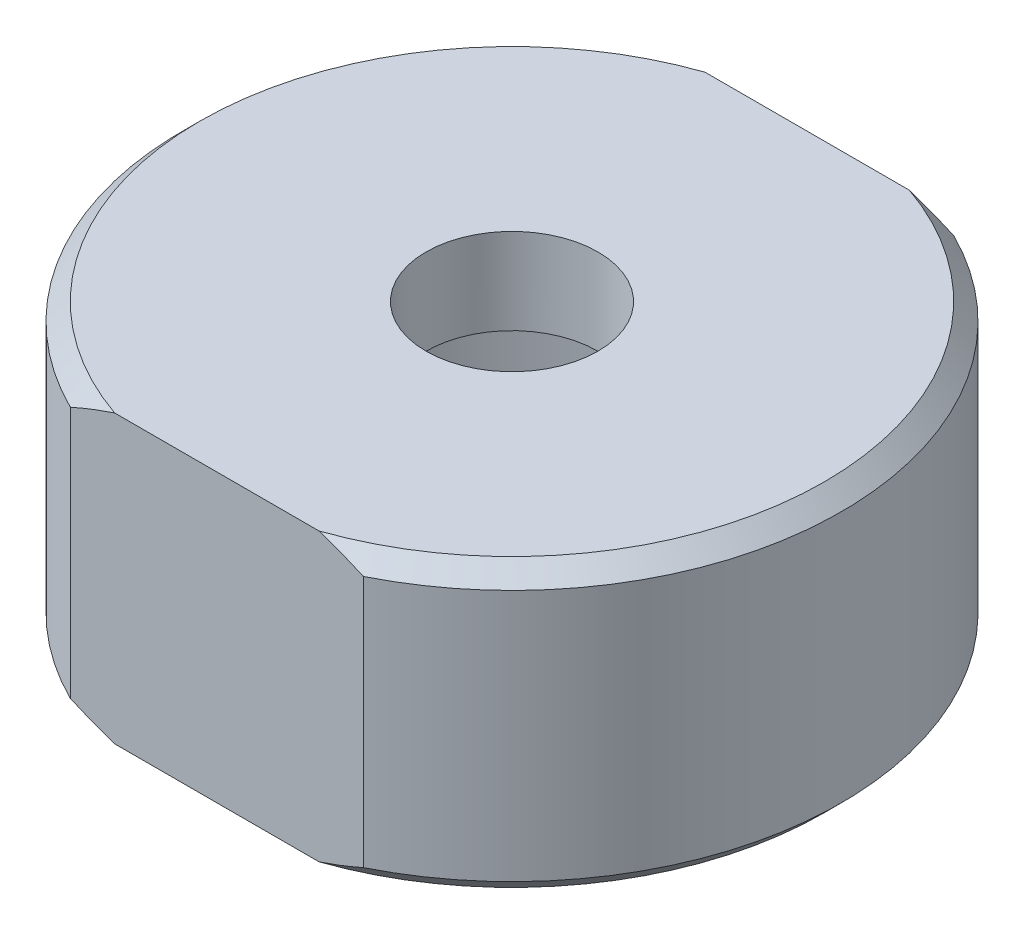
ISO-10303-21;
HEADER;
FILE_DESCRIPTION(('STEP AP214'),'2;1');
FILE_NAME('part.step','',(''),(''),'','','');
FILE_SCHEMA(('AUTOMOTIVE_DESIGN { 1 0 10303 214 1 1 1 1 }'));
ENDSEC;
DATA;
#1=APPLICATION_CONTEXT('core data for automotive mechanical design processes');
#2=APPLICATION_PROTOCOL_DEFINITION('international standard','automotive_design',2000,#1);
#3=PRODUCT_CONTEXT('',#1,'mechanical');
#4=PRODUCT('Part','Part','',(#3));
#5=PRODUCT_RELATED_PRODUCT_CATEGORY('part','',(#4));
#6=PRODUCT_DEFINITION_FORMATION('','',#4);
#7=PRODUCT_DEFINITION_CONTEXT('part definition',#1,'design');
#8=PRODUCT_DEFINITION('design','',#6,#7);
#9=PRODUCT_DEFINITION_SHAPE('','',#8);
#10=(LENGTH_UNIT() NAMED_UNIT(*) SI_UNIT(.MILLI.,.METRE.));
#11=(NAMED_UNIT(*) PLANE_ANGLE_UNIT() SI_UNIT($,.RADIAN.));
#12=(NAMED_UNIT(*) SI_UNIT($,.STERADIAN.) SOLID_ANGLE_UNIT());
#13=UNCERTAINTY_MEASURE_WITH_UNIT(LENGTH_MEASURE(1.E-05),#10,'distance_accuracy_value','');
#14=(GEOMETRIC_REPRESENTATION_CONTEXT(3) GLOBAL_UNCERTAINTY_ASSIGNED_CONTEXT((#13)) GLOBAL_UNIT_ASSIGNED_CONTEXT((#10,
#11,#12)) REPRESENTATION_CONTEXT('',''));
#15=CARTESIAN_POINT('',(0.,0.,0.));
#16=DIRECTION('',(0.,0.,1.));
#17=DIRECTION('',(1.,0.,0.));
#18=AXIS2_PLACEMENT_3D('',#15,#16,#17);
#19=CARTESIAN_POINT('',(0.,5.,0.));
#20=DIRECTION('',(0.,-1.,0.));
#21=DIRECTION('',(0.,0.,-1.));
#22=AXIS2_PLACEMENT_3D('',#19,#20,#21);
#23=CYLINDRICAL_SURFACE('',#22,1.5);
#24=CARTESIAN_POINT('',(0.,5.,0.));
#25=DIRECTION('',(0.,1.,0.));
#26=DIRECTION('',(0.,0.,1.));
#27=AXIS2_PLACEMENT_3D('',#24,#25,#26);
#28=CIRCLE('',#27,1.5);
#29=CARTESIAN_POINT('',(0.,5.,1.5));
#30=VERTEX_POINT('',#29);
#31=EDGE_CURVE('E225',#30,#30,#28,.T.);
#32=ORIENTED_EDGE('',*,*,#31,.T.);
#33=EDGE_LOOP('',(#32));
#34=FACE_BOUND('',#33,.T.);
#35=CARTESIAN_POINT('',(0.,3.5,0.));
#36=DIRECTION('',(0.,-1.,0.));
#37=DIRECTION('',(0.,0.,-1.));
#38=AXIS2_PLACEMENT_3D('',#35,#36,#37);
#39=CIRCLE('',#38,1.5);
#40=CARTESIAN_POINT('',(0.,3.5,-1.5));
#41=VERTEX_POINT('',#40);
#42=EDGE_CURVE('E134',#41,#41,#39,.T.);
#43=ORIENTED_EDGE('',*,*,#42,.T.);
#44=EDGE_LOOP('',(#43));
#45=FACE_BOUND('',#44,.T.);
#46=ADVANCED_FACE('F37',(#34,#45),#23,.F.);
#47=CARTESIAN_POINT('',(0.,5.,0.));
#48=DIRECTION('',(0.,1.,0.));
#49=DIRECTION('',(0.,0.,1.));
#50=AXIS2_PLACEMENT_3D('',#47,#48,#49);
#51=PLANE('',#50);
#52=DIRECTION('',(-1.,0.,0.));
#53=VECTOR('',#52,1.);
#54=CARTESIAN_POINT('',(-2.55734237050889,5.,-5.15));
#55=LINE('',#54,#53);
#56=CARTESIAN_POINT('',(1.78325545001272,5.,-5.15));
#57=VERTEX_POINT('',#56);
#58=CARTESIAN_POINT('',(-1.78325545001272,5.,-5.15));
#59=VERTEX_POINT('',#58);
#60=EDGE_CURVE('E241',#57,#59,#55,.T.);
#61=ORIENTED_EDGE('',*,*,#60,.T.);
#62=CARTESIAN_POINT('',(0.,5.,0.));
#63=DIRECTION('',(0.,1.,0.));
#64=DIRECTION('',(0.,0.,1.));
#65=AXIS2_PLACEMENT_3D('',#62,#63,#64);
#66=CIRCLE('',#65,5.45000000000001);
#67=CARTESIAN_POINT('',(-1.78325545001272,5.,5.15));
#68=VERTEX_POINT('',#67);
#69=EDGE_CURVE('E11',#59,#68,#66,.T.);
#70=ORIENTED_EDGE('',*,*,#69,.T.);
#71=DIRECTION('',(1.,0.,0.));
#72=VECTOR('',#71,1.);
#73=CARTESIAN_POINT('',(-2.55734237050889,5.,5.15));
#74=LINE('',#73,#72);
#75=CARTESIAN_POINT('',(1.78325545001272,5.,5.15));
#76=VERTEX_POINT('',#75);
#77=EDGE_CURVE('E111',#68,#76,#74,.T.);
#78=ORIENTED_EDGE('',*,*,#77,.T.);
#79=CARTESIAN_POINT('',(0.,5.,0.));
#80=DIRECTION('',(0.,1.,0.));
#81=DIRECTION('',(0.,0.,1.));
#82=AXIS2_PLACEMENT_3D('',#79,#80,#81);
#83=CIRCLE('',#82,5.45000000000001);
#84=EDGE_CURVE('E47',#76,#57,#83,.T.);
#85=ORIENTED_EDGE('',*,*,#84,.T.);
#86=EDGE_LOOP('',(#61,#70,#78,#85));
#87=FACE_BOUND('',#86,.T.);
#88=ORIENTED_EDGE('',*,*,#31,.F.);
#89=EDGE_LOOP('',(#88));
#90=FACE_BOUND('',#89,.T.);
#91=ADVANCED_FACE('F239',(#87,#90),#51,.T.);
#92=CARTESIAN_POINT('',(0.,0.,0.));
#93=DIRECTION('',(0.,1.,0.));
#94=DIRECTION('',(0.,0.,1.));
#95=AXIS2_PLACEMENT_3D('',#92,#93,#94);
#96=PLANE('',#95);
#97=CARTESIAN_POINT('',(0.,0.,0.));
#98=DIRECTION('',(0.,-1.,0.));
#99=DIRECTION('',(0.,0.,-1.));
#100=AXIS2_PLACEMENT_3D('',#97,#98,#99);
#101=CIRCLE('',#100,4.9);
#102=CARTESIAN_POINT('',(0.,0.,-4.9));
#103=VERTEX_POINT('',#102);
#104=EDGE_CURVE('E281',#103,#103,#101,.T.);
#105=ORIENTED_EDGE('',*,*,#104,.F.);
#106=EDGE_LOOP('',(#105));
#107=FACE_BOUND('',#106,.T.);
#108=DIRECTION('',(1.,0.,0.));
#109=VECTOR('',#108,1.);
#110=CARTESIAN_POINT('',(-2.55734237050889,0.,5.15));
#111=LINE('',#110,#109);
#112=CARTESIAN_POINT('',(-1.78325545001269,0.,5.15));
#113=VERTEX_POINT('',#112);
#114=CARTESIAN_POINT('',(1.78325545001269,0.,5.15));
#115=VERTEX_POINT('',#114);
#116=EDGE_CURVE('E219',#113,#115,#111,.T.);
#117=ORIENTED_EDGE('',*,*,#116,.F.);
#118=CARTESIAN_POINT('',(0.,0.,0.));
#119=DIRECTION('',(0.,1.,0.));
#120=DIRECTION('',(0.,0.,1.));
#121=AXIS2_PLACEMENT_3D('',#118,#119,#120);
#122=CIRCLE('',#121,5.45);
#123=CARTESIAN_POINT('',(-1.78325545001269,0.,-5.15));
#124=VERTEX_POINT('',#123);
#125=EDGE_CURVE('E213',#113,#124,#122,.F.);
#126=ORIENTED_EDGE('',*,*,#125,.T.);
#127=DIRECTION('',(-1.,0.,0.));
#128=VECTOR('',#127,1.);
#129=CARTESIAN_POINT('',(-2.55734237050889,0.,-5.15));
#130=LINE('',#129,#128);
#131=CARTESIAN_POINT('',(1.78325545001269,0.,-5.15));
#132=VERTEX_POINT('',#131);
#133=EDGE_CURVE('E224',#132,#124,#130,.T.);
#134=ORIENTED_EDGE('',*,*,#133,.F.);
#135=CARTESIAN_POINT('',(0.,0.,0.));
#136=DIRECTION('',(0.,1.,0.));
#137=DIRECTION('',(0.,0.,1.));
#138=AXIS2_PLACEMENT_3D('',#135,#136,#137);
#139=CIRCLE('',#138,5.45);
#140=EDGE_CURVE('E214',#132,#115,#139,.F.);
#141=ORIENTED_EDGE('',*,*,#140,.T.);
#142=EDGE_LOOP('',(#117,#126,#134,#141));
#143=FACE_BOUND('',#142,.T.);
#144=ADVANCED_FACE('F203',(#107,#143),#96,.F.);
#145=CARTESIAN_POINT('',(0.,5.,0.));
#146=DIRECTION('',(0.,-1.,0.));
#147=DIRECTION('',(0.,0.,-1.));
#148=AXIS2_PLACEMENT_3D('',#145,#146,#147);
#149=CYLINDRICAL_SURFACE('',#148,5.75);
#150=DIRECTION('',(0.,-1.,0.));
#151=VECTOR('',#150,1.);
#152=CARTESIAN_POINT('',(-2.55734237050889,5.,-5.15));
#153=LINE('',#152,#151);
#154=CARTESIAN_POINT('',(-2.55734237050889,4.70000000000001,-5.15));
#155=VERTEX_POINT('',#154);
#156=CARTESIAN_POINT('',(-2.55734237050889,0.300000000000002,-5.15));
#157=VERTEX_POINT('',#156);
#158=EDGE_CURVE('E244',#155,#157,#153,.T.);
#159=ORIENTED_EDGE('',*,*,#158,.T.);
#160=CARTESIAN_POINT('',(0.,0.300000000000002,0.));
#161=DIRECTION('',(0.,1.,0.));
#162=DIRECTION('',(0.,0.,1.));
#163=AXIS2_PLACEMENT_3D('',#160,#161,#162);
#164=CIRCLE('',#163,5.75);
#165=CARTESIAN_POINT('',(-2.55734237050889,0.300000000000002,5.15));
#166=VERTEX_POINT('',#165);
#167=EDGE_CURVE('E125',#157,#166,#164,.T.);
#168=ORIENTED_EDGE('',*,*,#167,.T.);
#169=DIRECTION('',(0.,-1.,0.));
#170=VECTOR('',#169,1.);
#171=CARTESIAN_POINT('',(-2.55734237050889,5.,5.15));
#172=LINE('',#171,#170);
#173=CARTESIAN_POINT('',(-2.55734237050889,4.70000000000001,5.15));
#174=VERTEX_POINT('',#173);
#175=EDGE_CURVE('E109',#174,#166,#172,.T.);
#176=ORIENTED_EDGE('',*,*,#175,.F.);
#177=CARTESIAN_POINT('',(0.,4.70000000000001,0.));
#178=DIRECTION('',(0.,1.,0.));
#179=DIRECTION('',(0.,0.,1.));
#180=AXIS2_PLACEMENT_3D('',#177,#178,#179);
#181=CIRCLE('',#180,5.75);
#182=EDGE_CURVE('E122',#174,#155,#181,.F.);
#183=ORIENTED_EDGE('',*,*,#182,.T.);
#184=EDGE_LOOP('',(#159,#168,#176,#183));
#185=FACE_BOUND('',#184,.T.);
#186=ADVANCED_FACE('F121',(#185),#149,.T.);
#187=CARTESIAN_POINT('',(-2.55734237050889,5.,5.15));
#188=DIRECTION('',(0.,0.,-1.));
#189=DIRECTION('',(-1.,0.,0.));
#190=AXIS2_PLACEMENT_3D('',#187,#188,#189);
#191=PLANE('',#190);
#192=ORIENTED_EDGE('',*,*,#175,.T.);
#193=CARTESIAN_POINT('',(-2.55734237050889,0.300000000000002,5.15));
#194=CARTESIAN_POINT('',(-2.49408513658219,0.271866940434455,5.15));
#195=CARTESIAN_POINT('',(-2.43051503447502,0.244430276893023,5.15));
#196=CARTESIAN_POINT('',(-2.30278256836839,0.191093803753824,5.15));
#197=CARTESIAN_POINT('',(-2.23862061788613,0.165193003038102,5.15));
#198=CARTESIAN_POINT('',(-2.10965167102442,0.1150338237567,5.15));
#199=CARTESIAN_POINT('',(-2.04484463755922,0.0907755402520462,5.15));
#200=CARTESIAN_POINT('',(-1.91454981373653,0.0440241591584713,5.15));
#201=CARTESIAN_POINT('',(-1.84906160649364,0.0215322245361105,5.15));
#202=CARTESIAN_POINT('',(-1.78325545001269,0.,5.15));
#203=B_SPLINE_CURVE_WITH_KNOTS('',3,(#193,#194,#195,#196,#197,#198,#199,#200,#201,#202),
.UNSPECIFIED.,.F.,.F.,(4,2,2,2,4),(0.,0.207693285008294,0.41525104985935,0.622820816909882,
0.830526121959454),.UNSPECIFIED.);
#204=EDGE_CURVE('E162',#166,#113,#203,.T.);
#205=ORIENTED_EDGE('',*,*,#204,.T.);
#206=ORIENTED_EDGE('',*,*,#116,.T.);
#207=CARTESIAN_POINT('',(1.78325545001269,0.,5.15));
#208=CARTESIAN_POINT('',(1.84906160649364,0.0215322245361104,5.15));
#209=CARTESIAN_POINT('',(1.91454981373653,0.0440241591584713,5.15));
#210=CARTESIAN_POINT('',(2.04484463755922,0.0907755402520462,5.15));
#211=CARTESIAN_POINT('',(2.10965167102442,0.1150338237567,5.15));
#212=CARTESIAN_POINT('',(2.23862061788613,0.165193003038102,5.15));
#213=CARTESIAN_POINT('',(2.30278256836839,0.191093803753824,5.15));
#214=CARTESIAN_POINT('',(2.43051503447502,0.244430276893023,5.15));
#215=CARTESIAN_POINT('',(2.49408513658219,0.271866940434455,5.15));
#216=CARTESIAN_POINT('',(2.55734237050889,0.300000000000002,5.15));
#217=B_SPLINE_CURVE_WITH_KNOTS('',3,(#207,#208,#209,#210,#211,#212,#213,#214,#215,#216),
.UNSPECIFIED.,.F.,.F.,(4,2,2,2,4),(0.,0.207705305049571,0.415275072100104,0.62283283695116,
0.830526121959454),.UNSPECIFIED.);
#218=CARTESIAN_POINT('',(2.55734237050889,0.300000000000002,5.15));
#219=VERTEX_POINT('',#218);
#220=EDGE_CURVE('E115',#115,#219,#217,.T.);
#221=ORIENTED_EDGE('',*,*,#220,.T.);
#222=DIRECTION('',(0.,-1.,0.));
#223=VECTOR('',#222,1.);
#224=CARTESIAN_POINT('',(2.55734237050889,5.,5.15));
#225=LINE('',#224,#223);
#226=CARTESIAN_POINT('',(2.55734237050889,4.70000000000001,5.15));
#227=VERTEX_POINT('',#226);
#228=EDGE_CURVE('E126',#227,#219,#225,.T.);
#229=ORIENTED_EDGE('',*,*,#228,.F.);
#230=CARTESIAN_POINT('',(2.55734237050889,4.70000000000001,5.15));
#231=CARTESIAN_POINT('',(2.4940851365822,4.72813305956555,5.15));
#232=CARTESIAN_POINT('',(2.43051503447502,4.75556972310698,5.15));
#233=CARTESIAN_POINT('',(2.3027825683684,4.80890619624618,5.15));
#234=CARTESIAN_POINT('',(2.23862061788614,4.8348069969619,5.15));
#235=CARTESIAN_POINT('',(2.10965167102444,4.8849661762433,5.15));
#236=CARTESIAN_POINT('',(2.04484463755923,4.90922445974796,5.15));
#237=CARTESIAN_POINT('',(1.91454981373656,4.95597584084153,5.15));
#238=CARTESIAN_POINT('',(1.84906160649366,4.97846777546389,5.15));
#239=CARTESIAN_POINT('',(1.78325545001272,5.,5.15));
#240=B_SPLINE_CURVE_WITH_KNOTS('',3,(#230,#231,#232,#233,#234,#235,#236,#237,#238,#239),
.UNSPECIFIED.,.F.,.F.,(4,2,2,2,4),(0.,0.207693285008287,0.415251049859336,0.622820816909862,
0.830526121959426),.UNSPECIFIED.);
#241=EDGE_CURVE('E116',#227,#76,#240,.T.);
#242=ORIENTED_EDGE('',*,*,#241,.T.);
#243=ORIENTED_EDGE('',*,*,#77,.F.);
#244=CARTESIAN_POINT('',(-1.78325545001272,5.,5.15));
#245=CARTESIAN_POINT('',(-1.84906160649366,4.97846777546389,5.15));
#246=CARTESIAN_POINT('',(-1.91454981373656,4.95597584084153,5.15));
#247=CARTESIAN_POINT('',(-2.04484463755924,4.90922445974796,5.15));
#248=CARTESIAN_POINT('',(-2.10965167102444,4.8849661762433,5.15));
#249=CARTESIAN_POINT('',(-2.23862061788614,4.8348069969619,5.15));
#250=CARTESIAN_POINT('',(-2.3027825683684,4.80890619624618,5.15));
#251=CARTESIAN_POINT('',(-2.43051503447502,4.75556972310698,5.15));
#252=CARTESIAN_POINT('',(-2.4940851365822,4.72813305956555,5.15));
#253=CARTESIAN_POINT('',(-2.55734237050889,4.70000000000001,5.15));
#254=B_SPLINE_CURVE_WITH_KNOTS('',3,(#244,#245,#246,#247,#248,#249,#250,#251,#252,#253),
.UNSPECIFIED.,.F.,.F.,(4,2,2,2,4),(0.,0.207705305049565,0.41527507210009,0.622832836951139,
0.830526121959425),.UNSPECIFIED.);
#255=EDGE_CURVE('E106',#68,#174,#254,.T.);
#256=ORIENTED_EDGE('',*,*,#255,.T.);
#257=EDGE_LOOP('',(#192,#205,#206,#221,#229,#242,#243,#256));
#258=FACE_BOUND('',#257,.T.);
#259=ADVANCED_FACE('F108',(#258),#191,.F.);
#260=CARTESIAN_POINT('',(0.,5.,0.));
#261=DIRECTION('',(0.,-1.,0.));
#262=DIRECTION('',(0.,0.,-1.));
#263=AXIS2_PLACEMENT_3D('',#260,#261,#262);
#264=CYLINDRICAL_SURFACE('',#263,5.75);
#265=ORIENTED_EDGE('',*,*,#228,.T.);
#266=CARTESIAN_POINT('',(0.,0.300000000000002,0.));
#267=DIRECTION('',(0.,1.,0.));
#268=DIRECTION('',(0.,0.,1.));
#269=AXIS2_PLACEMENT_3D('',#266,#267,#268);
#270=CIRCLE('',#269,5.75);
#271=CARTESIAN_POINT('',(2.55734237050889,0.300000000000002,-5.15));
#272=VERTEX_POINT('',#271);
#273=EDGE_CURVE('E229',#219,#272,#270,.T.);
#274=ORIENTED_EDGE('',*,*,#273,.T.);
#275=DIRECTION('',(0.,-1.,0.));
#276=VECTOR('',#275,1.);
#277=CARTESIAN_POINT('',(2.55734237050889,5.,-5.15));
#278=LINE('',#277,#276);
#279=CARTESIAN_POINT('',(2.55734237050889,4.70000000000001,-5.15));
#280=VERTEX_POINT('',#279);
#281=EDGE_CURVE('E246',#280,#272,#278,.T.);
#282=ORIENTED_EDGE('',*,*,#281,.F.);
#283=CARTESIAN_POINT('',(0.,4.70000000000001,0.));
#284=DIRECTION('',(0.,1.,0.));
#285=DIRECTION('',(0.,0.,1.));
#286=AXIS2_PLACEMENT_3D('',#283,#284,#285);
#287=CIRCLE('',#286,5.75);
#288=EDGE_CURVE('E228',#280,#227,#287,.F.);
#289=ORIENTED_EDGE('',*,*,#288,.T.);
#290=EDGE_LOOP('',(#265,#274,#282,#289));
#291=FACE_BOUND('',#290,.T.);
#292=ADVANCED_FACE('F150',(#291),#264,.T.);
#293=CARTESIAN_POINT('',(-2.55734237050889,5.,-5.15));
#294=DIRECTION('',(0.,0.,1.));
#295=DIRECTION('',(1.,0.,0.));
#296=AXIS2_PLACEMENT_3D('',#293,#294,#295);
#297=PLANE('',#296);
#298=ORIENTED_EDGE('',*,*,#133,.T.);
#299=CARTESIAN_POINT('',(-1.78325545001269,0.,-5.15));
#300=CARTESIAN_POINT('',(-1.84906160649364,0.0215322245361104,-5.15));
#301=CARTESIAN_POINT('',(-1.91454981373653,0.0440241591584713,-5.15));
#302=CARTESIAN_POINT('',(-2.04484463755922,0.0907755402520462,-5.15));
#303=CARTESIAN_POINT('',(-2.10965167102442,0.1150338237567,-5.15));
#304=CARTESIAN_POINT('',(-2.23862061788613,0.165193003038102,-5.15));
#305=CARTESIAN_POINT('',(-2.30278256836839,0.191093803753824,-5.15));
#306=CARTESIAN_POINT('',(-2.43051503447502,0.244430276893023,-5.15));
#307=CARTESIAN_POINT('',(-2.49408513658219,0.271866940434455,-5.15));
#308=CARTESIAN_POINT('',(-2.55734237050889,0.300000000000002,-5.15));
#309=B_SPLINE_CURVE_WITH_KNOTS('',3,(#299,#300,#301,#302,#303,#304,#305,#306,#307,#308),
.UNSPECIFIED.,.F.,.F.,(4,2,2,2,4),(0.,0.207705305049571,0.415275072100104,0.62283283695116,
0.830526121959454),.UNSPECIFIED.);
#310=EDGE_CURVE('E187',#124,#157,#309,.T.);
#311=ORIENTED_EDGE('',*,*,#310,.T.);
#312=ORIENTED_EDGE('',*,*,#158,.F.);
#313=CARTESIAN_POINT('',(-2.55734237050889,4.70000000000001,-5.15));
#314=CARTESIAN_POINT('',(-2.4940851365822,4.72813305956555,-5.15));
#315=CARTESIAN_POINT('',(-2.43051503447502,4.75556972310698,-5.15));
#316=CARTESIAN_POINT('',(-2.3027825683684,4.80890619624618,-5.15));
#317=CARTESIAN_POINT('',(-2.23862061788614,4.8348069969619,-5.15));
#318=CARTESIAN_POINT('',(-2.10965167102444,4.8849661762433,-5.15));
#319=CARTESIAN_POINT('',(-2.04484463755923,4.90922445974796,-5.15));
#320=CARTESIAN_POINT('',(-1.91454981373656,4.95597584084153,-5.15));
#321=CARTESIAN_POINT('',(-1.84906160649366,4.97846777546389,-5.15));
#322=CARTESIAN_POINT('',(-1.78325545001272,5.,-5.15));
#323=B_SPLINE_CURVE_WITH_KNOTS('',3,(#313,#314,#315,#316,#317,#318,#319,#320,#321,#322),
.UNSPECIFIED.,.F.,.F.,(4,2,2,2,4),(0.,0.207693285008287,0.415251049859336,0.622820816909862,
0.830526121959426),.UNSPECIFIED.);
#324=EDGE_CURVE('E130',#155,#59,#323,.T.);
#325=ORIENTED_EDGE('',*,*,#324,.T.);
#326=ORIENTED_EDGE('',*,*,#60,.F.);
#327=CARTESIAN_POINT('',(1.78325545001272,5.,-5.15));
#328=CARTESIAN_POINT('',(1.84906160649366,4.97846777546389,-5.15));
#329=CARTESIAN_POINT('',(1.91454981373656,4.95597584084153,-5.15));
#330=CARTESIAN_POINT('',(2.04484463755924,4.90922445974796,-5.15));
#331=CARTESIAN_POINT('',(2.10965167102444,4.8849661762433,-5.15));
#332=CARTESIAN_POINT('',(2.23862061788614,4.8348069969619,-5.15));
#333=CARTESIAN_POINT('',(2.3027825683684,4.80890619624618,-5.15));
#334=CARTESIAN_POINT('',(2.43051503447502,4.75556972310698,-5.15));
#335=CARTESIAN_POINT('',(2.4940851365822,4.72813305956555,-5.15));
#336=CARTESIAN_POINT('',(2.55734237050889,4.70000000000001,-5.15));
#337=B_SPLINE_CURVE_WITH_KNOTS('',3,(#327,#328,#329,#330,#331,#332,#333,#334,#335,#336),
.UNSPECIFIED.,.F.,.F.,(4,2,2,2,4),(0.,0.207705305049565,0.41527507210009,0.622832836951139,
0.830526121959425),.UNSPECIFIED.);
#338=EDGE_CURVE('E62',#57,#280,#337,.T.);
#339=ORIENTED_EDGE('',*,*,#338,.T.);
#340=ORIENTED_EDGE('',*,*,#281,.T.);
#341=CARTESIAN_POINT('',(2.55734237050889,0.300000000000002,-5.15));
#342=CARTESIAN_POINT('',(2.49408513658219,0.271866940434455,-5.15));
#343=CARTESIAN_POINT('',(2.43051503447502,0.244430276893023,-5.15));
#344=CARTESIAN_POINT('',(2.30278256836839,0.191093803753824,-5.15));
#345=CARTESIAN_POINT('',(2.23862061788613,0.165193003038102,-5.15));
#346=CARTESIAN_POINT('',(2.10965167102442,0.1150338237567,-5.15));
#347=CARTESIAN_POINT('',(2.04484463755922,0.0907755402520462,-5.15));
#348=CARTESIAN_POINT('',(1.91454981373653,0.0440241591584713,-5.15));
#349=CARTESIAN_POINT('',(1.84906160649364,0.0215322245361105,-5.15));
#350=CARTESIAN_POINT('',(1.78325545001269,0.,-5.15));
#351=B_SPLINE_CURVE_WITH_KNOTS('',3,(#341,#342,#343,#344,#345,#346,#347,#348,#349,#350),
.UNSPECIFIED.,.F.,.F.,(4,2,2,2,4),(0.,0.207693285008294,0.41525104985935,0.622820816909882,
0.830526121959454),.UNSPECIFIED.);
#352=EDGE_CURVE('E54',#272,#132,#351,.T.);
#353=ORIENTED_EDGE('',*,*,#352,.T.);
#354=EDGE_LOOP('',(#298,#311,#312,#325,#326,#339,#340,#353));
#355=FACE_BOUND('',#354,.T.);
#356=ADVANCED_FACE('F198',(#355),#297,.F.);
#357=CARTESIAN_POINT('',(0.,3.5,0.));
#358=DIRECTION('',(0.,-1.,0.));
#359=DIRECTION('',(0.,0.,-1.));
#360=AXIS2_PLACEMENT_3D('',#357,#358,#359);
#361=CYLINDRICAL_SURFACE('',#360,4.9);
#362=CARTESIAN_POINT('',(0.,3.5,0.));
#363=DIRECTION('',(0.,-1.,0.));
#364=DIRECTION('',(0.,0.,-1.));
#365=AXIS2_PLACEMENT_3D('',#362,#363,#364);
#366=CIRCLE('',#365,4.9);
#367=CARTESIAN_POINT('',(0.,3.5,-4.9));
#368=VERTEX_POINT('',#367);
#369=EDGE_CURVE('E280',#368,#368,#366,.T.);
#370=ORIENTED_EDGE('',*,*,#369,.F.);
#371=EDGE_LOOP('',(#370));
#372=FACE_BOUND('',#371,.T.);
#373=ORIENTED_EDGE('',*,*,#104,.T.);
#374=EDGE_LOOP('',(#373));
#375=FACE_BOUND('',#374,.T.);
#376=ADVANCED_FACE('F202',(#372,#375),#361,.F.);
#377=CARTESIAN_POINT('',(0.,3.5,0.));
#378=DIRECTION('',(0.,-1.,0.));
#379=DIRECTION('',(0.,0.,-1.));
#380=AXIS2_PLACEMENT_3D('',#377,#378,#379);
#381=PLANE('',#380);
#382=ORIENTED_EDGE('',*,*,#42,.F.);
#383=EDGE_LOOP('',(#382));
#384=FACE_BOUND('',#383,.T.);
#385=ORIENTED_EDGE('',*,*,#369,.T.);
#386=EDGE_LOOP('',(#385));
#387=FACE_BOUND('',#386,.T.);
#388=ADVANCED_FACE('F268',(#384,#387),#381,.T.);
#389=CARTESIAN_POINT('',(0.,0.300000000000002,0.));
#390=DIRECTION('',(0.,1.,0.));
#391=DIRECTION('',(0.,0.,1.));
#392=AXIS2_PLACEMENT_3D('',#389,#390,#391);
#393=CONICAL_SURFACE('',#392,5.75,0.785398163397453);
#394=ORIENTED_EDGE('',*,*,#310,.F.);
#395=ORIENTED_EDGE('',*,*,#125,.F.);
#396=ORIENTED_EDGE('',*,*,#204,.F.);
#397=ORIENTED_EDGE('',*,*,#167,.F.);
#398=EDGE_LOOP('',(#394,#395,#396,#397));
#399=FACE_BOUND('',#398,.T.);
#400=ADVANCED_FACE('F176',(#399),#393,.T.);
#401=CARTESIAN_POINT('',(0.,0.300000000000002,0.));
#402=DIRECTION('',(0.,1.,0.));
#403=DIRECTION('',(0.,0.,1.));
#404=AXIS2_PLACEMENT_3D('',#401,#402,#403);
#405=CONICAL_SURFACE('',#404,5.75,0.785398163397453);
#406=ORIENTED_EDGE('',*,*,#220,.F.);
#407=ORIENTED_EDGE('',*,*,#140,.F.);
#408=ORIENTED_EDGE('',*,*,#352,.F.);
#409=ORIENTED_EDGE('',*,*,#273,.F.);
#410=EDGE_LOOP('',(#406,#407,#408,#409));
#411=FACE_BOUND('',#410,.T.);
#412=ADVANCED_FACE('F169',(#411),#405,.T.);
#413=CARTESIAN_POINT('',(0.,5.,0.));
#414=DIRECTION('',(0.,-1.,0.));
#415=DIRECTION('',(0.,0.,-1.));
#416=AXIS2_PLACEMENT_3D('',#413,#414,#415);
#417=CONICAL_SURFACE('',#416,5.45000000000001,0.78539816339745);
#418=ORIENTED_EDGE('',*,*,#324,.F.);
#419=ORIENTED_EDGE('',*,*,#182,.F.);
#420=ORIENTED_EDGE('',*,*,#255,.F.);
#421=ORIENTED_EDGE('',*,*,#69,.F.);
#422=EDGE_LOOP('',(#418,#419,#420,#421));
#423=FACE_BOUND('',#422,.T.);
#424=ADVANCED_FACE('F129',(#423),#417,.T.);
#425=CARTESIAN_POINT('',(0.,5.,0.));
#426=DIRECTION('',(0.,-1.,0.));
#427=DIRECTION('',(0.,0.,-1.));
#428=AXIS2_PLACEMENT_3D('',#425,#426,#427);
#429=CONICAL_SURFACE('',#428,5.45000000000001,0.78539816339745);
#430=ORIENTED_EDGE('',*,*,#241,.F.);
#431=ORIENTED_EDGE('',*,*,#288,.F.);
#432=ORIENTED_EDGE('',*,*,#338,.F.);
#433=ORIENTED_EDGE('',*,*,#84,.F.);
#434=EDGE_LOOP('',(#430,#431,#432,#433));
#435=FACE_BOUND('',#434,.T.);
#436=ADVANCED_FACE('F40',(#435),#429,.T.);
#437=CLOSED_SHELL('',(#46,#91,#144,#186,#259,#292,#356,#376,#388,#400,#412,#424,#436));
#438=MANIFOLD_SOLID_BREP('B2',#437);
#439=ADVANCED_BREP_SHAPE_REPRESENTATION('',(#18,#438),#14);
#440=SHAPE_DEFINITION_REPRESENTATION(#9,#439);
ENDSEC;
END-ISO-10303-21;
